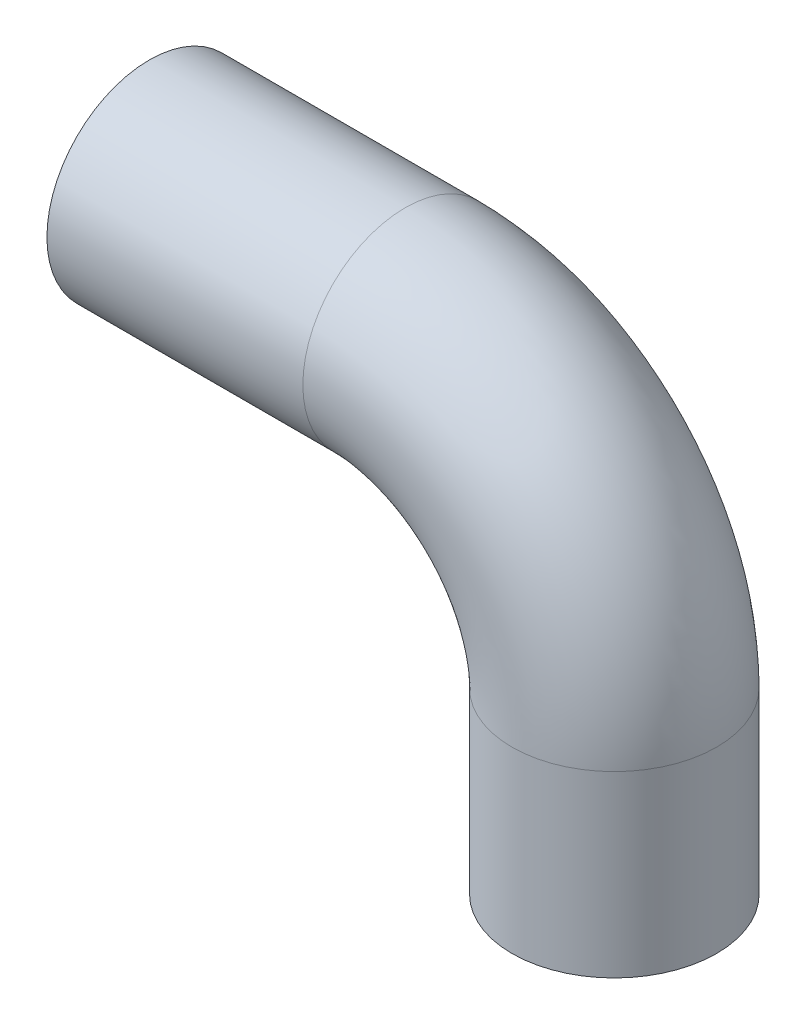
ISO-10303-21;
HEADER;
FILE_DESCRIPTION(('STEP AP214'),'2;1');
FILE_NAME('part.step','',(''),(''),'','','');
FILE_SCHEMA(('AUTOMOTIVE_DESIGN { 1 0 10303 214 1 1 1 1 }'));
ENDSEC;
DATA;
#1=APPLICATION_CONTEXT('core data for automotive mechanical design processes');
#2=APPLICATION_PROTOCOL_DEFINITION('international standard','automotive_design',2000,#1);
#3=PRODUCT_CONTEXT('',#1,'mechanical');
#4=PRODUCT('Part','Part','',(#3));
#5=PRODUCT_RELATED_PRODUCT_CATEGORY('part','',(#4));
#6=PRODUCT_DEFINITION_FORMATION('','',#4);
#7=PRODUCT_DEFINITION_CONTEXT('part definition',#1,'design');
#8=PRODUCT_DEFINITION('design','',#6,#7);
#9=PRODUCT_DEFINITION_SHAPE('','',#8);
#10=(LENGTH_UNIT() NAMED_UNIT(*) SI_UNIT(.MILLI.,.METRE.));
#11=(NAMED_UNIT(*) PLANE_ANGLE_UNIT() SI_UNIT($,.RADIAN.));
#12=(NAMED_UNIT(*) SI_UNIT($,.STERADIAN.) SOLID_ANGLE_UNIT());
#13=UNCERTAINTY_MEASURE_WITH_UNIT(LENGTH_MEASURE(1.E-05),#10,'distance_accuracy_value','');
#14=(GEOMETRIC_REPRESENTATION_CONTEXT(3) GLOBAL_UNCERTAINTY_ASSIGNED_CONTEXT((#13)) GLOBAL_UNIT_ASSIGNED_CONTEXT((#10,
#11,#12)) REPRESENTATION_CONTEXT('',''));
#15=CARTESIAN_POINT('',(0.,0.,0.));
#16=DIRECTION('',(0.,0.,1.));
#17=DIRECTION('',(1.,0.,0.));
#18=AXIS2_PLACEMENT_3D('',#15,#16,#17);
#19=CARTESIAN_POINT('',(0.,0.,0.));
#20=DIRECTION('',(1.,0.,0.));
#21=DIRECTION('',(0.,0.,-1.));
#22=AXIS2_PLACEMENT_3D('',#19,#20,#21);
#23=CYLINDRICAL_SURFACE('',#22,2.);
#24=CARTESIAN_POINT('',(5.,0.,0.));
#25=DIRECTION('',(1.,0.,0.));
#26=DIRECTION('',(0.,0.,-1.));
#27=AXIS2_PLACEMENT_3D('',#24,#25,#26);
#28=CIRCLE('',#27,2.);
#29=CARTESIAN_POINT('',(5.,2.,0.));
#30=VERTEX_POINT('',#29);
#31=EDGE_CURVE('E90',#30,#30,#28,.T.);
#32=ORIENTED_EDGE('',*,*,#31,.F.);
#33=EDGE_LOOP('',(#32));
#34=FACE_BOUND('',#33,.T.);
#35=CARTESIAN_POINT('',(0.,0.,0.));
#36=DIRECTION('',(1.,0.,0.));
#37=DIRECTION('',(0.,0.,-1.));
#38=AXIS2_PLACEMENT_3D('',#35,#36,#37);
#39=CIRCLE('',#38,2.);
#40=CARTESIAN_POINT('',(0.,0.,-2.));
#41=VERTEX_POINT('',#40);
#42=EDGE_CURVE('E55',#41,#41,#39,.T.);
#43=ORIENTED_EDGE('',*,*,#42,.T.);
#44=EDGE_LOOP('',(#43));
#45=FACE_BOUND('',#44,.T.);
#46=ADVANCED_FACE('F39',(#34,#45),#23,.T.);
#47=CARTESIAN_POINT('',(5.,-4.08485363842506,0.));
#48=DIRECTION('',(0.,0.,-1.));
#49=DIRECTION('',(-1.,0.,0.));
#50=AXIS2_PLACEMENT_3D('',#47,#48,#49);
#51=TOROIDAL_SURFACE('',#50,4.08485363842506,2.);
#52=CARTESIAN_POINT('',(9.08485363842506,-4.08485363842506,0.));
#53=DIRECTION('',(0.,-1.,0.));
#54=DIRECTION('',(0.,0.,-1.));
#55=AXIS2_PLACEMENT_3D('',#52,#53,#54);
#56=CIRCLE('',#55,2.);
#57=CARTESIAN_POINT('',(11.0848536384251,-4.08485363842506,0.));
#58=VERTEX_POINT('',#57);
#59=EDGE_CURVE('E43',#58,#58,#56,.T.);
#60=CARTESIAN_POINT('',(5.,-4.08485363842506,0.));
#61=DIRECTION('',(0.,0.,-1.));
#62=DIRECTION('',(-1.,0.,0.));
#63=AXIS2_PLACEMENT_3D('',#60,#61,#62);
#64=CIRCLE('',#63,6.08485363842506);
#65=EDGE_CURVE('',#30,#58,#64,.T.);
#66=ORIENTED_EDGE('',*,*,#31,.T.);
#67=ORIENTED_EDGE('',*,*,#59,.F.);
#68=ORIENTED_EDGE('',*,*,#65,.T.);
#69=ORIENTED_EDGE('',*,*,#65,.F.);
#70=EDGE_LOOP('',(#66,#68,#67,#69));
#71=FACE_BOUND('',#70,.T.);
#72=ADVANCED_FACE('F100',(#71),#51,.T.);
#73=CARTESIAN_POINT('',(9.08485363842506,-4.08485363842506,0.));
#74=DIRECTION('',(0.,-1.,0.));
#75=DIRECTION('',(1.,0.,0.));
#76=AXIS2_PLACEMENT_3D('',#73,#74,#75);
#77=CYLINDRICAL_SURFACE('',#76,2.);
#78=CARTESIAN_POINT('',(9.08485363842505,-7.57653061224489,0.));
#79=DIRECTION('',(0.,-1.,0.));
#80=DIRECTION('',(0.,0.,-1.));
#81=AXIS2_PLACEMENT_3D('',#78,#79,#80);
#82=CIRCLE('',#81,2.);
#83=CARTESIAN_POINT('',(9.08485363842505,-7.57653061224489,-2.));
#84=VERTEX_POINT('',#83);
#85=EDGE_CURVE('E60',#84,#84,#82,.T.);
#86=ORIENTED_EDGE('',*,*,#85,.F.);
#87=EDGE_LOOP('',(#86));
#88=FACE_BOUND('',#87,.T.);
#89=ORIENTED_EDGE('',*,*,#59,.T.);
#90=EDGE_LOOP('',(#89));
#91=FACE_BOUND('',#90,.T.);
#92=ADVANCED_FACE('F41',(#88,#91),#77,.T.);
#93=CARTESIAN_POINT('',(0.,0.,0.));
#94=DIRECTION('',(1.,0.,0.));
#95=DIRECTION('',(0.,0.,-1.));
#96=AXIS2_PLACEMENT_3D('',#93,#94,#95);
#97=PLANE('',#96);
#98=CARTESIAN_POINT('',(0.,0.,0.));
#99=DIRECTION('',(1.,0.,0.));
#100=DIRECTION('',(0.,0.,-1.));
#101=AXIS2_PLACEMENT_3D('',#98,#99,#100);
#102=CIRCLE('',#101,1.25);
#103=CARTESIAN_POINT('',(0.,0.,-1.25));
#104=VERTEX_POINT('',#103);
#105=EDGE_CURVE('E83',#104,#104,#102,.F.);
#106=ORIENTED_EDGE('',*,*,#105,.F.);
#107=EDGE_LOOP('',(#106));
#108=FACE_BOUND('',#107,.T.);
#109=ORIENTED_EDGE('',*,*,#42,.F.);
#110=EDGE_LOOP('',(#109));
#111=FACE_BOUND('',#110,.T.);
#112=ADVANCED_FACE('F106',(#108,#111),#97,.F.);
#113=CARTESIAN_POINT('',(9.08485363842505,-7.57653061224489,0.));
#114=DIRECTION('',(0.,-1.,0.));
#115=DIRECTION('',(0.,0.,-1.));
#116=AXIS2_PLACEMENT_3D('',#113,#114,#115);
#117=PLANE('',#116);
#118=CARTESIAN_POINT('',(9.08485363842505,-7.57653061224489,0.));
#119=DIRECTION('',(0.,-1.,0.));
#120=DIRECTION('',(0.,0.,-1.));
#121=AXIS2_PLACEMENT_3D('',#118,#119,#120);
#122=CIRCLE('',#121,1.25);
#123=CARTESIAN_POINT('',(9.08485363842505,-7.57653061224489,-1.25));
#124=VERTEX_POINT('',#123);
#125=EDGE_CURVE('E11',#124,#124,#122,.F.);
#126=ORIENTED_EDGE('',*,*,#125,.T.);
#127=EDGE_LOOP('',(#126));
#128=FACE_BOUND('',#127,.T.);
#129=ORIENTED_EDGE('',*,*,#85,.T.);
#130=EDGE_LOOP('',(#129));
#131=FACE_BOUND('',#130,.T.);
#132=ADVANCED_FACE('F67',(#128,#131),#117,.T.);
#133=CARTESIAN_POINT('',(0.,0.,0.));
#134=DIRECTION('',(1.,0.,0.));
#135=DIRECTION('',(0.,0.,-1.));
#136=AXIS2_PLACEMENT_3D('',#133,#134,#135);
#137=CYLINDRICAL_SURFACE('',#136,1.25);
#138=CARTESIAN_POINT('',(5.,0.,0.));
#139=DIRECTION('',(1.,0.,0.));
#140=DIRECTION('',(0.,0.,-1.));
#141=AXIS2_PLACEMENT_3D('',#138,#139,#140);
#142=CIRCLE('',#141,1.25);
#143=CARTESIAN_POINT('',(5.,1.25,0.));
#144=VERTEX_POINT('',#143);
#145=EDGE_CURVE('E79',#144,#144,#142,.F.);
#146=ORIENTED_EDGE('',*,*,#145,.F.);
#147=EDGE_LOOP('',(#146));
#148=FACE_BOUND('',#147,.T.);
#149=ORIENTED_EDGE('',*,*,#105,.T.);
#150=EDGE_LOOP('',(#149));
#151=FACE_BOUND('',#150,.T.);
#152=ADVANCED_FACE('F114',(#148,#151),#137,.F.);
#153=CARTESIAN_POINT('',(5.,-4.08485363842506,0.));
#154=DIRECTION('',(0.,0.,-1.));
#155=DIRECTION('',(-1.,0.,0.));
#156=AXIS2_PLACEMENT_3D('',#153,#154,#155);
#157=TOROIDAL_SURFACE('',#156,4.08485363842506,1.25);
#158=CARTESIAN_POINT('',(9.08485363842506,-4.08485363842506,0.));
#159=DIRECTION('',(0.,-1.,0.));
#160=DIRECTION('',(0.,0.,-1.));
#161=AXIS2_PLACEMENT_3D('',#158,#159,#160);
#162=CIRCLE('',#161,1.25);
#163=CARTESIAN_POINT('',(10.3348536384251,-4.08485363842506,0.));
#164=VERTEX_POINT('',#163);
#165=EDGE_CURVE('E49',#164,#164,#162,.F.);
#166=CARTESIAN_POINT('',(5.,-4.08485363842506,0.));
#167=DIRECTION('',(0.,0.,-1.));
#168=DIRECTION('',(-1.,0.,0.));
#169=AXIS2_PLACEMENT_3D('',#166,#167,#168);
#170=CIRCLE('',#169,5.33485363842506);
#171=EDGE_CURVE('',#144,#164,#170,.T.);
#172=ORIENTED_EDGE('',*,*,#145,.T.);
#173=ORIENTED_EDGE('',*,*,#165,.F.);
#174=ORIENTED_EDGE('',*,*,#171,.T.);
#175=ORIENTED_EDGE('',*,*,#171,.F.);
#176=EDGE_LOOP('',(#172,#174,#173,#175));
#177=FACE_BOUND('',#176,.T.);
#178=ADVANCED_FACE('F73',(#177),#157,.F.);
#179=CARTESIAN_POINT('',(9.08485363842506,-4.08485363842506,0.));
#180=DIRECTION('',(0.,-1.,0.));
#181=DIRECTION('',(1.,0.,0.));
#182=AXIS2_PLACEMENT_3D('',#179,#180,#181);
#183=CYLINDRICAL_SURFACE('',#182,1.25);
#184=ORIENTED_EDGE('',*,*,#125,.F.);
#185=EDGE_LOOP('',(#184));
#186=FACE_BOUND('',#185,.T.);
#187=ORIENTED_EDGE('',*,*,#165,.T.);
#188=EDGE_LOOP('',(#187));
#189=FACE_BOUND('',#188,.T.);
#190=ADVANCED_FACE('F70',(#186,#189),#183,.F.);
#191=CLOSED_SHELL('',(#46,#72,#92,#112,#132,#152,#178,#190));
#192=MANIFOLD_SOLID_BREP('B2',#191);
#193=ADVANCED_BREP_SHAPE_REPRESENTATION('',(#18,#192),#14);
#194=SHAPE_DEFINITION_REPRESENTATION(#9,#193);
ENDSEC;
END-ISO-10303-21;
